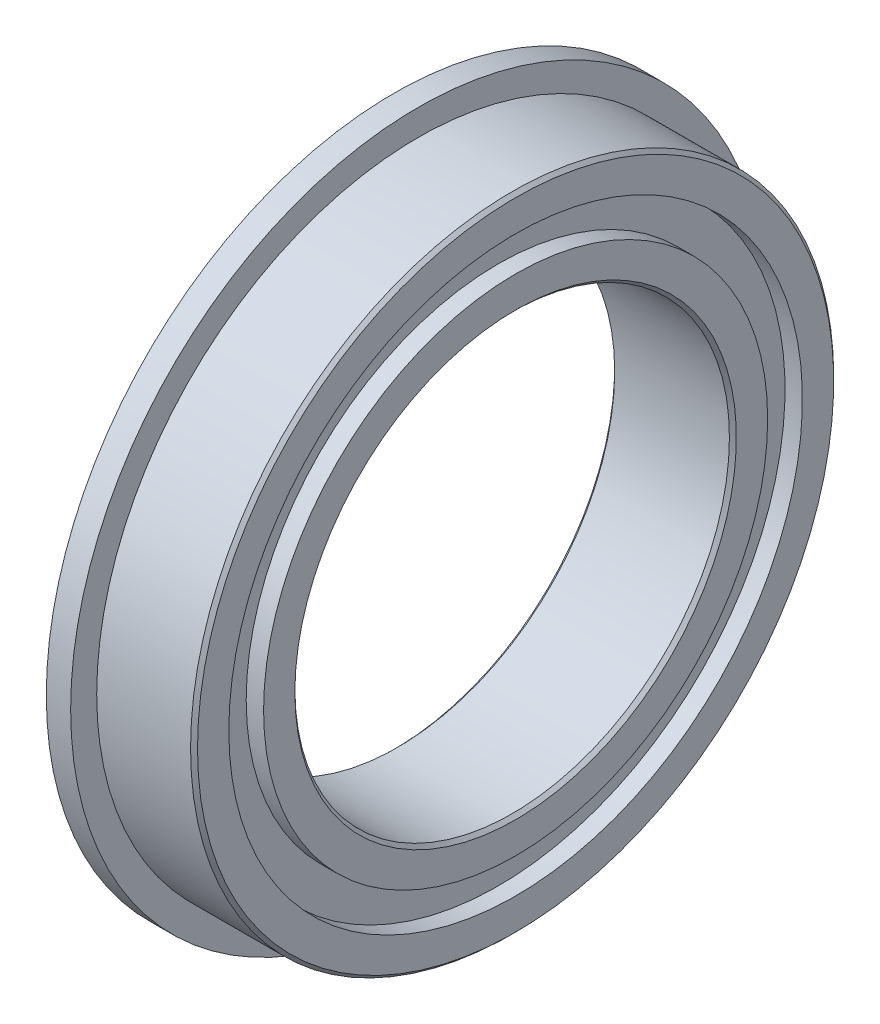
ISO-10303-21;
HEADER;
FILE_DESCRIPTION(('STEP AP214'),'2;1');
FILE_NAME('part.step','',(''),(''),'','','');
FILE_SCHEMA(('AUTOMOTIVE_DESIGN { 1 0 10303 214 1 1 1 1 }'));
ENDSEC;
DATA;
#1=APPLICATION_CONTEXT('core data for automotive mechanical design processes');
#2=APPLICATION_PROTOCOL_DEFINITION('international standard','automotive_design',2000,#1);
#3=PRODUCT_CONTEXT('',#1,'mechanical');
#4=PRODUCT('Part','Part','',(#3));
#5=PRODUCT_RELATED_PRODUCT_CATEGORY('part','',(#4));
#6=PRODUCT_DEFINITION_FORMATION('','',#4);
#7=PRODUCT_DEFINITION_CONTEXT('part definition',#1,'design');
#8=PRODUCT_DEFINITION('design','',#6,#7);
#9=PRODUCT_DEFINITION_SHAPE('','',#8);
#10=(LENGTH_UNIT() NAMED_UNIT(*) SI_UNIT(.MILLI.,.METRE.));
#11=(NAMED_UNIT(*) PLANE_ANGLE_UNIT() SI_UNIT($,.RADIAN.));
#12=(NAMED_UNIT(*) SI_UNIT($,.STERADIAN.) SOLID_ANGLE_UNIT());
#13=UNCERTAINTY_MEASURE_WITH_UNIT(LENGTH_MEASURE(1.E-05),#10,'distance_accuracy_value','');
#14=(GEOMETRIC_REPRESENTATION_CONTEXT(3) GLOBAL_UNCERTAINTY_ASSIGNED_CONTEXT((#13)) GLOBAL_UNIT_ASSIGNED_CONTEXT((#10,
#11,#12)) REPRESENTATION_CONTEXT('',''));
#15=CARTESIAN_POINT('',(0.,0.,0.));
#16=DIRECTION('',(0.,0.,1.));
#17=DIRECTION('',(1.,0.,0.));
#18=AXIS2_PLACEMENT_3D('',#15,#16,#17);
#19=CARTESIAN_POINT('',(7.,0.,-14.5));
#20=DIRECTION('',(-1.,0.,0.));
#21=DIRECTION('',(0.,0.,1.));
#22=AXIS2_PLACEMENT_3D('',#19,#20,#21);
#23=PLANE('',#22);
#24=CARTESIAN_POINT('',(7.,0.,0.));
#25=DIRECTION('',(-1.,0.,0.));
#26=DIRECTION('',(0.,0.,1.));
#27=AXIS2_PLACEMENT_3D('',#24,#25,#26);
#28=CIRCLE('',#27,14.5);
#29=CARTESIAN_POINT('',(7.,0.,14.5));
#30=VERTEX_POINT('',#29);
#31=EDGE_CURVE('E87',#30,#30,#28,.T.);
#32=ORIENTED_EDGE('',*,*,#31,.F.);
#33=EDGE_LOOP('',(#32));
#34=FACE_BOUND('',#33,.T.);
#35=CARTESIAN_POINT('',(7.,0.,0.));
#36=DIRECTION('',(-1.,0.,0.));
#37=DIRECTION('',(0.,0.,1.));
#38=AXIS2_PLACEMENT_3D('',#35,#36,#37);
#39=CIRCLE('',#38,12.7);
#40=CARTESIAN_POINT('',(7.,0.,12.7));
#41=VERTEX_POINT('',#40);
#42=EDGE_CURVE('E10',#41,#41,#39,.T.);
#43=ORIENTED_EDGE('',*,*,#42,.T.);
#44=EDGE_LOOP('',(#43));
#45=FACE_BOUND('',#44,.T.);
#46=ADVANCED_FACE('F32',(#34,#45),#23,.F.);
#47=CARTESIAN_POINT('',(6.8,0.,0.));
#48=DIRECTION('',(1.,0.,0.));
#49=DIRECTION('',(0.,0.,-1.));
#50=AXIS2_PLACEMENT_3D('',#47,#48,#49);
#51=CONICAL_SURFACE('',#50,12.5,0.78539816339745);
#52=ORIENTED_EDGE('',*,*,#42,.F.);
#53=EDGE_LOOP('',(#52));
#54=FACE_BOUND('',#53,.T.);
#55=CARTESIAN_POINT('',(6.8,0.,0.));
#56=DIRECTION('',(-1.,0.,0.));
#57=DIRECTION('',(0.,0.,1.));
#58=AXIS2_PLACEMENT_3D('',#55,#56,#57);
#59=CIRCLE('',#58,12.5);
#60=CARTESIAN_POINT('',(6.8,0.,12.5));
#61=VERTEX_POINT('',#60);
#62=EDGE_CURVE('E38',#61,#61,#59,.T.);
#63=ORIENTED_EDGE('',*,*,#62,.T.);
#64=EDGE_LOOP('',(#63));
#65=FACE_BOUND('',#64,.T.);
#66=ADVANCED_FACE('F94',(#54,#65),#51,.F.);
#67=CARTESIAN_POINT('',(0.,0.,0.));
#68=DIRECTION('',(-1.,0.,0.));
#69=DIRECTION('',(0.,0.,1.));
#70=AXIS2_PLACEMENT_3D('',#67,#68,#69);
#71=CYLINDRICAL_SURFACE('',#70,12.5);
#72=ORIENTED_EDGE('',*,*,#62,.F.);
#73=EDGE_LOOP('',(#72));
#74=FACE_BOUND('',#73,.T.);
#75=CARTESIAN_POINT('',(0.2,0.,0.));
#76=DIRECTION('',(-1.,0.,0.));
#77=DIRECTION('',(0.,0.,1.));
#78=AXIS2_PLACEMENT_3D('',#75,#76,#77);
#79=CIRCLE('',#78,12.5);
#80=CARTESIAN_POINT('',(0.2,0.,12.5));
#81=VERTEX_POINT('',#80);
#82=EDGE_CURVE('E42',#81,#81,#79,.T.);
#83=ORIENTED_EDGE('',*,*,#82,.T.);
#84=EDGE_LOOP('',(#83));
#85=FACE_BOUND('',#84,.T.);
#86=ADVANCED_FACE('F98',(#74,#85),#71,.F.);
#87=CARTESIAN_POINT('',(0.,0.,0.));
#88=DIRECTION('',(-1.,0.,0.));
#89=DIRECTION('',(0.,0.,1.));
#90=AXIS2_PLACEMENT_3D('',#87,#88,#89);
#91=CONICAL_SURFACE('',#90,12.7,0.785398163397449);
#92=ORIENTED_EDGE('',*,*,#82,.F.);
#93=EDGE_LOOP('',(#92));
#94=FACE_BOUND('',#93,.T.);
#95=CARTESIAN_POINT('',(0.,0.,0.));
#96=DIRECTION('',(-1.,0.,0.));
#97=DIRECTION('',(0.,0.,1.));
#98=AXIS2_PLACEMENT_3D('',#95,#96,#97);
#99=CIRCLE('',#98,12.7);
#100=CARTESIAN_POINT('',(0.,0.,12.7));
#101=VERTEX_POINT('',#100);
#102=EDGE_CURVE('E46',#101,#101,#99,.T.);
#103=ORIENTED_EDGE('',*,*,#102,.T.);
#104=EDGE_LOOP('',(#103));
#105=FACE_BOUND('',#104,.T.);
#106=ADVANCED_FACE('F103',(#94,#105),#91,.F.);
#107=CARTESIAN_POINT('',(0.,0.,-12.7));
#108=DIRECTION('',(1.,0.,0.));
#109=DIRECTION('',(0.,0.,-1.));
#110=AXIS2_PLACEMENT_3D('',#107,#108,#109);
#111=PLANE('',#110);
#112=ORIENTED_EDGE('',*,*,#102,.F.);
#113=EDGE_LOOP('',(#112));
#114=FACE_BOUND('',#113,.T.);
#115=CARTESIAN_POINT('',(0.,0.,0.));
#116=DIRECTION('',(-1.,0.,0.));
#117=DIRECTION('',(0.,0.,1.));
#118=AXIS2_PLACEMENT_3D('',#115,#116,#117);
#119=CIRCLE('',#118,14.5);
#120=CARTESIAN_POINT('',(0.,0.,14.5));
#121=VERTEX_POINT('',#120);
#122=EDGE_CURVE('E51',#121,#121,#119,.T.);
#123=ORIENTED_EDGE('',*,*,#122,.T.);
#124=EDGE_LOOP('',(#123));
#125=FACE_BOUND('',#124,.T.);
#126=ADVANCED_FACE('F109',(#114,#125),#111,.F.);
#127=CARTESIAN_POINT('',(0.,0.,0.));
#128=DIRECTION('',(-1.,0.,0.));
#129=DIRECTION('',(0.,0.,1.));
#130=AXIS2_PLACEMENT_3D('',#127,#128,#129);
#131=CYLINDRICAL_SURFACE('',#130,14.5);
#132=ORIENTED_EDGE('',*,*,#122,.F.);
#133=EDGE_LOOP('',(#132));
#134=FACE_BOUND('',#133,.T.);
#135=CARTESIAN_POINT('',(0.999999999999999,0.,0.));
#136=DIRECTION('',(-1.,0.,0.));
#137=DIRECTION('',(0.,0.,1.));
#138=AXIS2_PLACEMENT_3D('',#135,#136,#137);
#139=CIRCLE('',#138,14.5);
#140=CARTESIAN_POINT('',(0.999999999999999,0.,14.5));
#141=VERTEX_POINT('',#140);
#142=EDGE_CURVE('E54',#141,#141,#139,.T.);
#143=ORIENTED_EDGE('',*,*,#142,.T.);
#144=EDGE_LOOP('',(#143));
#145=FACE_BOUND('',#144,.T.);
#146=ADVANCED_FACE('F113',(#134,#145),#131,.T.);
#147=CARTESIAN_POINT('',(0.999999999999999,0.,-14.5));
#148=DIRECTION('',(1.,0.,0.));
#149=DIRECTION('',(0.,0.,-1.));
#150=AXIS2_PLACEMENT_3D('',#147,#148,#149);
#151=PLANE('',#150);
#152=ORIENTED_EDGE('',*,*,#142,.F.);
#153=EDGE_LOOP('',(#152));
#154=FACE_BOUND('',#153,.T.);
#155=CARTESIAN_POINT('',(0.999999999999998,0.,0.));
#156=DIRECTION('',(-1.,0.,0.));
#157=DIRECTION('',(0.,0.,1.));
#158=AXIS2_PLACEMENT_3D('',#155,#156,#157);
#159=CIRCLE('',#158,16.5);
#160=CARTESIAN_POINT('',(0.999999999999998,0.,16.5));
#161=VERTEX_POINT('',#160);
#162=EDGE_CURVE('E57',#161,#161,#159,.T.);
#163=ORIENTED_EDGE('',*,*,#162,.T.);
#164=EDGE_LOOP('',(#163));
#165=FACE_BOUND('',#164,.T.);
#166=ADVANCED_FACE('F117',(#154,#165),#151,.F.);
#167=CARTESIAN_POINT('',(0.,0.,0.));
#168=DIRECTION('',(-1.,0.,0.));
#169=DIRECTION('',(0.,0.,1.));
#170=AXIS2_PLACEMENT_3D('',#167,#168,#169);
#171=CYLINDRICAL_SURFACE('',#170,16.5);
#172=ORIENTED_EDGE('',*,*,#162,.F.);
#173=EDGE_LOOP('',(#172));
#174=FACE_BOUND('',#173,.T.);
#175=CARTESIAN_POINT('',(0.,0.,0.));
#176=DIRECTION('',(-1.,0.,0.));
#177=DIRECTION('',(0.,0.,1.));
#178=AXIS2_PLACEMENT_3D('',#175,#176,#177);
#179=CIRCLE('',#178,16.5);
#180=CARTESIAN_POINT('',(0.,0.,16.5));
#181=VERTEX_POINT('',#180);
#182=EDGE_CURVE('E60',#181,#181,#179,.T.);
#183=ORIENTED_EDGE('',*,*,#182,.T.);
#184=EDGE_LOOP('',(#183));
#185=FACE_BOUND('',#184,.T.);
#186=ADVANCED_FACE('F121',(#174,#185),#171,.F.);
#187=CARTESIAN_POINT('',(0.,0.,-16.5));
#188=DIRECTION('',(1.,0.,0.));
#189=DIRECTION('',(0.,0.,-1.));
#190=AXIS2_PLACEMENT_3D('',#187,#188,#189);
#191=PLANE('',#190);
#192=ORIENTED_EDGE('',*,*,#182,.F.);
#193=EDGE_LOOP('',(#192));
#194=FACE_BOUND('',#193,.T.);
#195=CARTESIAN_POINT('',(0.,0.,0.));
#196=DIRECTION('',(-1.,0.,0.));
#197=DIRECTION('',(0.,0.,1.));
#198=AXIS2_PLACEMENT_3D('',#195,#196,#197);
#199=CIRCLE('',#198,20.);
#200=CARTESIAN_POINT('',(0.,0.,20.));
#201=VERTEX_POINT('',#200);
#202=EDGE_CURVE('E63',#201,#201,#199,.T.);
#203=ORIENTED_EDGE('',*,*,#202,.T.);
#204=EDGE_LOOP('',(#203));
#205=FACE_BOUND('',#204,.T.);
#206=ADVANCED_FACE('F125',(#194,#205),#191,.F.);
#207=CARTESIAN_POINT('',(0.,0.,0.));
#208=DIRECTION('',(-1.,0.,0.));
#209=DIRECTION('',(0.,0.,1.));
#210=AXIS2_PLACEMENT_3D('',#207,#208,#209);
#211=CYLINDRICAL_SURFACE('',#210,20.);
#212=ORIENTED_EDGE('',*,*,#202,.F.);
#213=EDGE_LOOP('',(#212));
#214=FACE_BOUND('',#213,.T.);
#215=CARTESIAN_POINT('',(1.4,0.,0.));
#216=DIRECTION('',(-1.,0.,0.));
#217=DIRECTION('',(0.,0.,1.));
#218=AXIS2_PLACEMENT_3D('',#215,#216,#217);
#219=CIRCLE('',#218,20.);
#220=CARTESIAN_POINT('',(1.4,0.,20.));
#221=VERTEX_POINT('',#220);
#222=EDGE_CURVE('E66',#221,#221,#219,.T.);
#223=ORIENTED_EDGE('',*,*,#222,.T.);
#224=EDGE_LOOP('',(#223));
#225=FACE_BOUND('',#224,.T.);
#226=ADVANCED_FACE('F129',(#214,#225),#211,.T.);
#227=CARTESIAN_POINT('',(1.4,0.,-20.));
#228=DIRECTION('',(-1.,0.,0.));
#229=DIRECTION('',(0.,0.,1.));
#230=AXIS2_PLACEMENT_3D('',#227,#228,#229);
#231=PLANE('',#230);
#232=ORIENTED_EDGE('',*,*,#222,.F.);
#233=EDGE_LOOP('',(#232));
#234=FACE_BOUND('',#233,.T.);
#235=CARTESIAN_POINT('',(1.4,0.,0.));
#236=DIRECTION('',(-1.,0.,0.));
#237=DIRECTION('',(0.,0.,1.));
#238=AXIS2_PLACEMENT_3D('',#235,#236,#237);
#239=CIRCLE('',#238,18.5);
#240=CARTESIAN_POINT('',(1.4,0.,18.5));
#241=VERTEX_POINT('',#240);
#242=EDGE_CURVE('E69',#241,#241,#239,.T.);
#243=ORIENTED_EDGE('',*,*,#242,.T.);
#244=EDGE_LOOP('',(#243));
#245=FACE_BOUND('',#244,.T.);
#246=ADVANCED_FACE('F133',(#234,#245),#231,.F.);
#247=CARTESIAN_POINT('',(0.,0.,0.));
#248=DIRECTION('',(-1.,0.,0.));
#249=DIRECTION('',(0.,0.,1.));
#250=AXIS2_PLACEMENT_3D('',#247,#248,#249);
#251=CYLINDRICAL_SURFACE('',#250,18.5);
#252=ORIENTED_EDGE('',*,*,#242,.F.);
#253=EDGE_LOOP('',(#252));
#254=FACE_BOUND('',#253,.T.);
#255=CARTESIAN_POINT('',(6.8,0.,0.));
#256=DIRECTION('',(-1.,0.,0.));
#257=DIRECTION('',(0.,0.,1.));
#258=AXIS2_PLACEMENT_3D('',#255,#256,#257);
#259=CIRCLE('',#258,18.5);
#260=CARTESIAN_POINT('',(6.8,0.,18.5));
#261=VERTEX_POINT('',#260);
#262=EDGE_CURVE('E72',#261,#261,#259,.T.);
#263=ORIENTED_EDGE('',*,*,#262,.T.);
#264=EDGE_LOOP('',(#263));
#265=FACE_BOUND('',#264,.T.);
#266=ADVANCED_FACE('F137',(#254,#265),#251,.T.);
#267=CARTESIAN_POINT('',(7.,0.,0.));
#268=DIRECTION('',(-1.,0.,0.));
#269=DIRECTION('',(0.,0.,1.));
#270=AXIS2_PLACEMENT_3D('',#267,#268,#269);
#271=CONICAL_SURFACE('',#270,18.3,0.785398163397438);
#272=ORIENTED_EDGE('',*,*,#262,.F.);
#273=EDGE_LOOP('',(#272));
#274=FACE_BOUND('',#273,.T.);
#275=CARTESIAN_POINT('',(7.,0.,0.));
#276=DIRECTION('',(-1.,0.,0.));
#277=DIRECTION('',(0.,0.,1.));
#278=AXIS2_PLACEMENT_3D('',#275,#276,#277);
#279=CIRCLE('',#278,18.3);
#280=CARTESIAN_POINT('',(7.,0.,18.3));
#281=VERTEX_POINT('',#280);
#282=EDGE_CURVE('E75',#281,#281,#279,.T.);
#283=ORIENTED_EDGE('',*,*,#282,.T.);
#284=EDGE_LOOP('',(#283));
#285=FACE_BOUND('',#284,.T.);
#286=ADVANCED_FACE('F141',(#274,#285),#271,.T.);
#287=CARTESIAN_POINT('',(7.,0.,-18.3));
#288=DIRECTION('',(-1.,0.,0.));
#289=DIRECTION('',(0.,0.,1.));
#290=AXIS2_PLACEMENT_3D('',#287,#288,#289);
#291=PLANE('',#290);
#292=ORIENTED_EDGE('',*,*,#282,.F.);
#293=EDGE_LOOP('',(#292));
#294=FACE_BOUND('',#293,.T.);
#295=CARTESIAN_POINT('',(7.,0.,0.));
#296=DIRECTION('',(-1.,0.,0.));
#297=DIRECTION('',(0.,0.,1.));
#298=AXIS2_PLACEMENT_3D('',#295,#296,#297);
#299=CIRCLE('',#298,16.5);
#300=CARTESIAN_POINT('',(7.,0.,16.5));
#301=VERTEX_POINT('',#300);
#302=EDGE_CURVE('E78',#301,#301,#299,.T.);
#303=ORIENTED_EDGE('',*,*,#302,.T.);
#304=EDGE_LOOP('',(#303));
#305=FACE_BOUND('',#304,.T.);
#306=ADVANCED_FACE('F145',(#294,#305),#291,.F.);
#307=CARTESIAN_POINT('',(0.,0.,0.));
#308=DIRECTION('',(-1.,0.,0.));
#309=DIRECTION('',(0.,0.,1.));
#310=AXIS2_PLACEMENT_3D('',#307,#308,#309);
#311=CYLINDRICAL_SURFACE('',#310,16.5);
#312=ORIENTED_EDGE('',*,*,#302,.F.);
#313=EDGE_LOOP('',(#312));
#314=FACE_BOUND('',#313,.T.);
#315=CARTESIAN_POINT('',(6.,0.,0.));
#316=DIRECTION('',(-1.,0.,0.));
#317=DIRECTION('',(0.,0.,1.));
#318=AXIS2_PLACEMENT_3D('',#315,#316,#317);
#319=CIRCLE('',#318,16.5);
#320=CARTESIAN_POINT('',(6.,0.,16.5));
#321=VERTEX_POINT('',#320);
#322=EDGE_CURVE('E81',#321,#321,#319,.T.);
#323=ORIENTED_EDGE('',*,*,#322,.T.);
#324=EDGE_LOOP('',(#323));
#325=FACE_BOUND('',#324,.T.);
#326=ADVANCED_FACE('F149',(#314,#325),#311,.F.);
#327=CARTESIAN_POINT('',(6.,0.,-14.5));
#328=DIRECTION('',(-1.,0.,0.));
#329=DIRECTION('',(0.,0.,1.));
#330=AXIS2_PLACEMENT_3D('',#327,#328,#329);
#331=PLANE('',#330);
#332=ORIENTED_EDGE('',*,*,#322,.F.);
#333=EDGE_LOOP('',(#332));
#334=FACE_BOUND('',#333,.T.);
#335=CARTESIAN_POINT('',(6.,0.,0.));
#336=DIRECTION('',(-1.,0.,0.));
#337=DIRECTION('',(0.,0.,1.));
#338=AXIS2_PLACEMENT_3D('',#335,#336,#337);
#339=CIRCLE('',#338,14.5);
#340=CARTESIAN_POINT('',(6.,0.,14.5));
#341=VERTEX_POINT('',#340);
#342=EDGE_CURVE('E84',#341,#341,#339,.T.);
#343=ORIENTED_EDGE('',*,*,#342,.T.);
#344=EDGE_LOOP('',(#343));
#345=FACE_BOUND('',#344,.T.);
#346=ADVANCED_FACE('F153',(#334,#345),#331,.F.);
#347=CARTESIAN_POINT('',(0.,0.,0.));
#348=DIRECTION('',(-1.,0.,0.));
#349=DIRECTION('',(0.,0.,1.));
#350=AXIS2_PLACEMENT_3D('',#347,#348,#349);
#351=CYLINDRICAL_SURFACE('',#350,14.5);
#352=ORIENTED_EDGE('',*,*,#342,.F.);
#353=EDGE_LOOP('',(#352));
#354=FACE_BOUND('',#353,.T.);
#355=ORIENTED_EDGE('',*,*,#31,.T.);
#356=EDGE_LOOP('',(#355));
#357=FACE_BOUND('',#356,.T.);
#358=ADVANCED_FACE('F91',(#354,#357),#351,.T.);
#359=CLOSED_SHELL('',(#46,#66,#86,#106,#126,#146,#166,#186,#206,#226,#246,#266,#286,#306,#326,
#346,#358));
#360=MANIFOLD_SOLID_BREP('B2',#359);
#361=ADVANCED_BREP_SHAPE_REPRESENTATION('',(#18,#360),#14);
#362=SHAPE_DEFINITION_REPRESENTATION(#9,#361);
ENDSEC;
END-ISO-10303-21;
